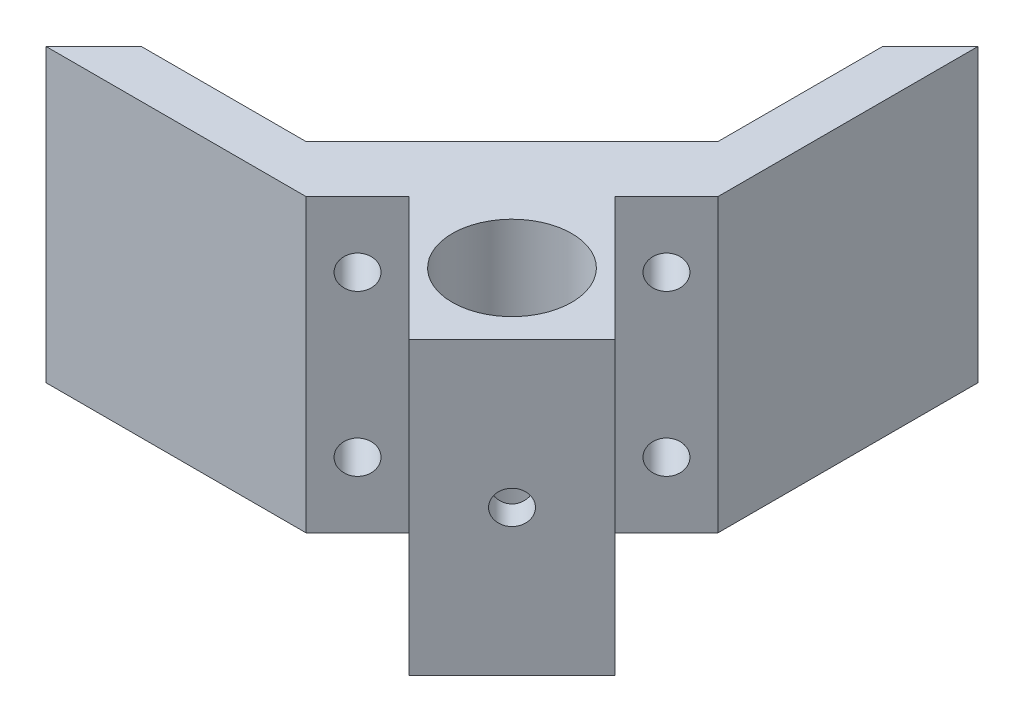
ISO-10303-21;
HEADER;
FILE_DESCRIPTION(('STEP AP214'),'2;1');
FILE_NAME('part.step','',(''),(''),'','','');
FILE_SCHEMA(('AUTOMOTIVE_DESIGN { 1 0 10303 214 1 1 1 1 }'));
ENDSEC;
DATA;
#1=APPLICATION_CONTEXT('core data for automotive mechanical design processes');
#2=APPLICATION_PROTOCOL_DEFINITION('international standard','automotive_design',2000,#1);
#3=PRODUCT_CONTEXT('',#1,'mechanical');
#4=PRODUCT('Part','Part','',(#3));
#5=PRODUCT_RELATED_PRODUCT_CATEGORY('part','',(#4));
#6=PRODUCT_DEFINITION_FORMATION('','',#4);
#7=PRODUCT_DEFINITION_CONTEXT('part definition',#1,'design');
#8=PRODUCT_DEFINITION('design','',#6,#7);
#9=PRODUCT_DEFINITION_SHAPE('','',#8);
#10=(LENGTH_UNIT() NAMED_UNIT(*) SI_UNIT(.MILLI.,.METRE.));
#11=(NAMED_UNIT(*) PLANE_ANGLE_UNIT() SI_UNIT($,.RADIAN.));
#12=(NAMED_UNIT(*) SI_UNIT($,.STERADIAN.) SOLID_ANGLE_UNIT());
#13=UNCERTAINTY_MEASURE_WITH_UNIT(LENGTH_MEASURE(1.E-05),#10,'distance_accuracy_value','');
#14=(GEOMETRIC_REPRESENTATION_CONTEXT(3) GLOBAL_UNCERTAINTY_ASSIGNED_CONTEXT((#13)) GLOBAL_UNIT_ASSIGNED_CONTEXT((#10,
#11,#12)) REPRESENTATION_CONTEXT('',''));
#15=CARTESIAN_POINT('',(0.,0.,0.));
#16=DIRECTION('',(0.,0.,1.));
#17=DIRECTION('',(1.,0.,0.));
#18=AXIS2_PLACEMENT_3D('',#15,#16,#17);
#19=CARTESIAN_POINT('',(22.3223304703363,0.,22.3223304703363));
#20=DIRECTION('',(0.707106781186548,0.,0.707106781186547));
#21=DIRECTION('',(0.707106781186547,0.,-0.707106781186548));
#22=AXIS2_PLACEMENT_3D('',#19,#20,#21);
#23=PLANE('',#22);
#24=CARTESIAN_POINT('',(35.5805826175841,38.75,9.06407832308853));
#25=DIRECTION('',(0.707106781186548,0.,0.707106781186547));
#26=DIRECTION('',(0.707106781186547,0.,-0.707106781186548));
#27=AXIS2_PLACEMENT_3D('',#24,#25,#26);
#28=CIRCLE('',#27,2.84999999999999);
#29=CARTESIAN_POINT('',(37.5958369439658,38.75,7.04882399670688));
#30=VERTEX_POINT('',#29);
#31=EDGE_CURVE('E415',#30,#30,#28,.T.);
#32=ORIENTED_EDGE('',*,*,#31,.F.);
#33=EDGE_LOOP('',(#32));
#34=FACE_BOUND('',#33,.T.);
#35=CARTESIAN_POINT('',(35.5805826175843,11.25,9.06407832308833));
#36=DIRECTION('',(0.707106781186548,0.,0.707106781186547));
#37=DIRECTION('',(0.707106781186547,0.,-0.707106781186548));
#38=AXIS2_PLACEMENT_3D('',#35,#36,#37);
#39=CIRCLE('',#38,2.84999999999999);
#40=CARTESIAN_POINT('',(37.595836943966,11.25,7.04882399670668));
#41=VERTEX_POINT('',#40);
#42=EDGE_CURVE('E399',#41,#41,#39,.T.);
#43=ORIENTED_EDGE('',*,*,#42,.F.);
#44=EDGE_LOOP('',(#43));
#45=FACE_BOUND('',#44,.T.);
#46=DIRECTION('',(0.,1.,0.));
#47=VECTOR('',#46,1.);
#48=CARTESIAN_POINT('',(31.1611652351682,50.,13.4834957055045));
#49=LINE('',#48,#47);
#50=CARTESIAN_POINT('',(31.1611652351682,0.,13.4834957055045));
#51=VERTEX_POINT('',#50);
#52=CARTESIAN_POINT('',(31.1611652351682,50.,13.4834957055045));
#53=VERTEX_POINT('',#52);
#54=EDGE_CURVE('E88',#51,#53,#49,.T.);
#55=ORIENTED_EDGE('',*,*,#54,.F.);
#56=DIRECTION('',(0.707106781186547,0.,-0.707106781186548));
#57=VECTOR('',#56,1.);
#58=CARTESIAN_POINT('',(22.3223304703363,0.,22.3223304703363));
#59=LINE('',#58,#57);
#60=CARTESIAN_POINT('',(40.,0.,4.64466094067263));
#61=VERTEX_POINT('',#60);
#62=EDGE_CURVE('E196',#51,#61,#59,.T.);
#63=ORIENTED_EDGE('',*,*,#62,.T.);
#64=DIRECTION('',(0.,1.,0.));
#65=VECTOR('',#64,1.);
#66=CARTESIAN_POINT('',(40.,0.,4.64466094067263));
#67=LINE('',#66,#65);
#68=CARTESIAN_POINT('',(40.,50.,4.64466094067263));
#69=VERTEX_POINT('',#68);
#70=EDGE_CURVE('E203',#61,#69,#67,.T.);
#71=ORIENTED_EDGE('',*,*,#70,.T.);
#72=DIRECTION('',(0.707106781186547,0.,-0.707106781186548));
#73=VECTOR('',#72,1.);
#74=CARTESIAN_POINT('',(22.3223304703363,50.,22.3223304703363));
#75=LINE('',#74,#73);
#76=EDGE_CURVE('E93',#53,#69,#75,.T.);
#77=ORIENTED_EDGE('',*,*,#76,.F.);
#78=EDGE_LOOP('',(#55,#63,#71,#77));
#79=FACE_BOUND('',#78,.T.);
#80=ADVANCED_FACE('F69',(#34,#45,#79),#23,.T.);
#81=CARTESIAN_POINT('',(-40.,50.,40.));
#82=DIRECTION('',(-0.707106781186548,0.,-0.707106781186547));
#83=DIRECTION('',(-0.707106781186547,0.,0.707106781186548));
#84=AXIS2_PLACEMENT_3D('',#81,#82,#83);
#85=PLANE('',#84);
#86=DIRECTION('',(0.707106781186547,0.,-0.707106781186548));
#87=VECTOR('',#86,1.);
#88=CARTESIAN_POINT('',(-40.,0.,40.));
#89=LINE('',#88,#87);
#90=CARTESIAN_POINT('',(31.8198051533946,0.,-31.8198051533947));
#91=VERTEX_POINT('',#90);
#92=CARTESIAN_POINT('',(40.,0.,-40.));
#93=VERTEX_POINT('',#92);
#94=EDGE_CURVE('E233',#91,#93,#89,.T.);
#95=ORIENTED_EDGE('',*,*,#94,.F.);
#96=DIRECTION('',(0.,1.,0.));
#97=VECTOR('',#96,1.);
#98=CARTESIAN_POINT('',(31.8198051533946,0.,-31.8198051533947));
#99=LINE('',#98,#97);
#100=CARTESIAN_POINT('',(31.8198051533946,50.,-31.8198051533947));
#101=VERTEX_POINT('',#100);
#102=EDGE_CURVE('E226',#91,#101,#99,.T.);
#103=ORIENTED_EDGE('',*,*,#102,.T.);
#104=DIRECTION('',(0.707106781186547,0.,-0.707106781186548));
#105=VECTOR('',#104,1.);
#106=CARTESIAN_POINT('',(-40.,50.,40.));
#107=LINE('',#106,#105);
#108=CARTESIAN_POINT('',(40.,50.,-40.));
#109=VERTEX_POINT('',#108);
#110=EDGE_CURVE('E247',#101,#109,#107,.T.);
#111=ORIENTED_EDGE('',*,*,#110,.T.);
#112=DIRECTION('',(0.,-1.,0.));
#113=VECTOR('',#112,1.);
#114=CARTESIAN_POINT('',(40.,50.,-40.));
#115=LINE('',#114,#113);
#116=EDGE_CURVE('E74',#109,#93,#115,.T.);
#117=ORIENTED_EDGE('',*,*,#116,.T.);
#118=EDGE_LOOP('',(#95,#103,#111,#117));
#119=FACE_BOUND('',#118,.T.);
#120=ADVANCED_FACE('F279',(#119),#85,.T.);
#121=CARTESIAN_POINT('',(0.,0.,0.));
#122=DIRECTION('',(0.,-1.,0.));
#123=DIRECTION('',(0.,0.,-1.));
#124=AXIS2_PLACEMENT_3D('',#121,#122,#123);
#125=PLANE('',#124);
#126=CARTESIAN_POINT('',(32.9289321881345,0.,32.9289321881345));
#127=DIRECTION('',(0.,1.,0.));
#128=DIRECTION('',(0.,0.,1.));
#129=AXIS2_PLACEMENT_3D('',#126,#127,#128);
#130=CIRCLE('',#129,10.25);
#131=CARTESIAN_POINT('',(32.9289321881345,0.,43.1789321881345));
#132=VERTEX_POINT('',#131);
#133=EDGE_CURVE('E357',#132,#132,#130,.T.);
#134=ORIENTED_EDGE('',*,*,#133,.T.);
#135=EDGE_LOOP('',(#134));
#136=FACE_BOUND('',#135,.T.);
#137=CARTESIAN_POINT('',(4.64466094067267,0.,40.));
#138=VERTEX_POINT('',#137);
#139=CARTESIAN_POINT('',(13.4834957055045,0.,31.1611652351682));
#140=VERTEX_POINT('',#139);
#141=EDGE_CURVE('E194',#138,#140,#59,.T.);
#142=ORIENTED_EDGE('',*,*,#141,.F.);
#143=DIRECTION('',(1.,0.,0.));
#144=VECTOR('',#143,1.);
#145=CARTESIAN_POINT('',(-40.,0.,40.));
#146=LINE('',#145,#144);
#147=CARTESIAN_POINT('',(-40.,0.,40.));
#148=VERTEX_POINT('',#147);
#149=EDGE_CURVE('E263',#148,#138,#146,.T.);
#150=ORIENTED_EDGE('',*,*,#149,.F.);
#151=CARTESIAN_POINT('',(-31.8198051533946,0.,31.8198051533947));
#152=VERTEX_POINT('',#151);
#153=EDGE_CURVE('E254',#148,#152,#89,.T.);
#154=ORIENTED_EDGE('',*,*,#153,.T.);
#155=DIRECTION('',(-1.,0.,0.));
#156=VECTOR('',#155,1.);
#157=CARTESIAN_POINT('',(0.,0.,31.8198051533947));
#158=LINE('',#157,#156);
#159=CARTESIAN_POINT('',(-3.53553390593274,0.,31.8198051533947));
#160=VERTEX_POINT('',#159);
#161=EDGE_CURVE('E208',#160,#152,#158,.T.);
#162=ORIENTED_EDGE('',*,*,#161,.F.);
#163=DIRECTION('',(0.707106781186547,0.,-0.707106781186548));
#164=VECTOR('',#163,1.);
#165=CARTESIAN_POINT('',(14.142135623731,0.,14.1421356237309));
#166=LINE('',#165,#164);
#167=CARTESIAN_POINT('',(31.8198051533946,0.,-3.53553390593273));
#168=VERTEX_POINT('',#167);
#169=EDGE_CURVE('E211',#160,#168,#166,.T.);
#170=ORIENTED_EDGE('',*,*,#169,.T.);
#171=DIRECTION('',(0.,0.,-1.));
#172=VECTOR('',#171,1.);
#173=CARTESIAN_POINT('',(31.8198051533946,0.,0.));
#174=LINE('',#173,#172);
#175=EDGE_CURVE('E216',#168,#91,#174,.T.);
#176=ORIENTED_EDGE('',*,*,#175,.T.);
#177=ORIENTED_EDGE('',*,*,#94,.T.);
#178=DIRECTION('',(0.,0.,1.));
#179=VECTOR('',#178,1.);
#180=CARTESIAN_POINT('',(40.,0.,-40.));
#181=LINE('',#180,#179);
#182=EDGE_CURVE('E259',#93,#61,#181,.T.);
#183=ORIENTED_EDGE('',*,*,#182,.T.);
#184=ORIENTED_EDGE('',*,*,#62,.F.);
#185=DIRECTION('',(-0.707106781186548,0.,-0.707106781186547));
#186=VECTOR('',#185,1.);
#187=CARTESIAN_POINT('',(52.3743686707646,0.,34.6966991411009));
#188=LINE('',#187,#186);
#189=CARTESIAN_POINT('',(52.3743686707646,0.,34.6966991411009));
#190=VERTEX_POINT('',#189);
#191=EDGE_CURVE('E334',#190,#51,#188,.T.);
#192=ORIENTED_EDGE('',*,*,#191,.F.);
#193=DIRECTION('',(0.707106781186547,0.,-0.707106781186548));
#194=VECTOR('',#193,1.);
#195=CARTESIAN_POINT('',(34.6966991411009,0.,52.3743686707646));
#196=LINE('',#195,#194);
#197=CARTESIAN_POINT('',(34.6966991411009,0.,52.3743686707646));
#198=VERTEX_POINT('',#197);
#199=EDGE_CURVE('E171',#198,#190,#196,.T.);
#200=ORIENTED_EDGE('',*,*,#199,.F.);
#201=DIRECTION('',(-0.707106781186548,0.,-0.707106781186547));
#202=VECTOR('',#201,1.);
#203=CARTESIAN_POINT('',(34.6966991411009,0.,52.3743686707646));
#204=LINE('',#203,#202);
#205=EDGE_CURVE('E191',#198,#140,#204,.T.);
#206=ORIENTED_EDGE('',*,*,#205,.T.);
#207=EDGE_LOOP('',(#142,#150,#154,#162,#170,#176,#177,#183,#184,#192,#200,#206));
#208=FACE_BOUND('',#207,.T.);
#209=ADVANCED_FACE('F287',(#136,#208),#125,.T.);
#210=DIRECTION('',(0.,1.,0.));
#211=VECTOR('',#210,1.);
#212=CARTESIAN_POINT('',(-31.8198051533946,0.,31.8198051533947));
#213=LINE('',#212,#211);
#214=CARTESIAN_POINT('',(-31.8198051533946,50.,31.8198051533947));
#215=VERTEX_POINT('',#214);
#216=EDGE_CURVE('E219',#152,#215,#213,.T.);
#217=ORIENTED_EDGE('',*,*,#216,.F.);
#218=ORIENTED_EDGE('',*,*,#153,.F.);
#219=DIRECTION('',(0.,-1.,0.));
#220=VECTOR('',#219,1.);
#221=CARTESIAN_POINT('',(-40.,50.,40.));
#222=LINE('',#221,#220);
#223=CARTESIAN_POINT('',(-40.,50.,40.));
#224=VERTEX_POINT('',#223);
#225=EDGE_CURVE('E12',#224,#148,#222,.T.);
#226=ORIENTED_EDGE('',*,*,#225,.F.);
#227=EDGE_CURVE('E242',#224,#215,#107,.T.);
#228=ORIENTED_EDGE('',*,*,#227,.T.);
#229=EDGE_LOOP('',(#217,#218,#226,#228));
#230=FACE_BOUND('',#229,.T.);
#231=ADVANCED_FACE('F75',(#230),#85,.T.);
#232=CARTESIAN_POINT('',(-40.,50.,40.));
#233=DIRECTION('',(0.,0.,-1.));
#234=DIRECTION('',(-1.,0.,0.));
#235=AXIS2_PLACEMENT_3D('',#232,#233,#234);
#236=PLANE('',#235);
#237=ORIENTED_EDGE('',*,*,#149,.T.);
#238=DIRECTION('',(0.,1.,0.));
#239=VECTOR('',#238,1.);
#240=CARTESIAN_POINT('',(4.64466094067267,0.,40.));
#241=LINE('',#240,#239);
#242=CARTESIAN_POINT('',(4.64466094067267,50.,40.));
#243=VERTEX_POINT('',#242);
#244=EDGE_CURVE('E197',#138,#243,#241,.T.);
#245=ORIENTED_EDGE('',*,*,#244,.T.);
#246=DIRECTION('',(1.,0.,0.));
#247=VECTOR('',#246,1.);
#248=CARTESIAN_POINT('',(-40.,50.,40.));
#249=LINE('',#248,#247);
#250=EDGE_CURVE('E252',#224,#243,#249,.T.);
#251=ORIENTED_EDGE('',*,*,#250,.F.);
#252=ORIENTED_EDGE('',*,*,#225,.T.);
#253=EDGE_LOOP('',(#237,#245,#251,#252));
#254=FACE_BOUND('',#253,.T.);
#255=ADVANCED_FACE('F511',(#254),#236,.F.);
#256=CARTESIAN_POINT('',(40.,50.,-40.));
#257=DIRECTION('',(1.,0.,0.));
#258=DIRECTION('',(0.,0.,-1.));
#259=AXIS2_PLACEMENT_3D('',#256,#257,#258);
#260=PLANE('',#259);
#261=ORIENTED_EDGE('',*,*,#70,.F.);
#262=ORIENTED_EDGE('',*,*,#182,.F.);
#263=ORIENTED_EDGE('',*,*,#116,.F.);
#264=DIRECTION('',(0.,0.,1.));
#265=VECTOR('',#264,1.);
#266=CARTESIAN_POINT('',(40.,50.,-40.));
#267=LINE('',#266,#265);
#268=EDGE_CURVE('E250',#109,#69,#267,.T.);
#269=ORIENTED_EDGE('',*,*,#268,.T.);
#270=EDGE_LOOP('',(#261,#262,#263,#269));
#271=FACE_BOUND('',#270,.T.);
#272=ADVANCED_FACE('F285',(#271),#260,.T.);
#273=CARTESIAN_POINT('',(0.,50.,0.));
#274=DIRECTION('',(0.,-1.,0.));
#275=DIRECTION('',(0.,0.,-1.));
#276=AXIS2_PLACEMENT_3D('',#273,#274,#275);
#277=PLANE('',#276);
#278=CARTESIAN_POINT('',(32.9289321881345,50.,32.9289321881345));
#279=DIRECTION('',(0.,1.,0.));
#280=DIRECTION('',(0.,0.,1.));
#281=AXIS2_PLACEMENT_3D('',#278,#279,#280);
#282=CIRCLE('',#281,10.25);
#283=CARTESIAN_POINT('',(32.9289321881345,50.,43.1789321881345));
#284=VERTEX_POINT('',#283);
#285=EDGE_CURVE('E365',#284,#284,#282,.T.);
#286=ORIENTED_EDGE('',*,*,#285,.F.);
#287=EDGE_LOOP('',(#286));
#288=FACE_BOUND('',#287,.T.);
#289=ORIENTED_EDGE('',*,*,#250,.T.);
#290=CARTESIAN_POINT('',(13.4834957055045,50.,31.1611652351682));
#291=VERTEX_POINT('',#290);
#292=EDGE_CURVE('E190',#243,#291,#75,.T.);
#293=ORIENTED_EDGE('',*,*,#292,.T.);
#294=DIRECTION('',(-0.707106781186548,0.,-0.707106781186547));
#295=VECTOR('',#294,1.);
#296=CARTESIAN_POINT('',(34.6966991411009,50.,52.3743686707646));
#297=LINE('',#296,#295);
#298=CARTESIAN_POINT('',(34.6966991411009,50.,52.3743686707646));
#299=VERTEX_POINT('',#298);
#300=EDGE_CURVE('E164',#299,#291,#297,.T.);
#301=ORIENTED_EDGE('',*,*,#300,.F.);
#302=DIRECTION('',(-0.707106781186547,0.,0.707106781186548));
#303=VECTOR('',#302,1.);
#304=CARTESIAN_POINT('',(34.6966991411009,50.,52.3743686707646));
#305=LINE('',#304,#303);
#306=CARTESIAN_POINT('',(52.3743686707646,50.,34.6966991411009));
#307=VERTEX_POINT('',#306);
#308=EDGE_CURVE('E160',#307,#299,#305,.T.);
#309=ORIENTED_EDGE('',*,*,#308,.F.);
#310=DIRECTION('',(-0.707106781186548,0.,-0.707106781186547));
#311=VECTOR('',#310,1.);
#312=CARTESIAN_POINT('',(52.3743686707646,50.,34.6966991411009));
#313=LINE('',#312,#311);
#314=EDGE_CURVE('E165',#307,#53,#313,.T.);
#315=ORIENTED_EDGE('',*,*,#314,.T.);
#316=ORIENTED_EDGE('',*,*,#76,.T.);
#317=ORIENTED_EDGE('',*,*,#268,.F.);
#318=ORIENTED_EDGE('',*,*,#110,.F.);
#319=DIRECTION('',(0.,0.,-1.));
#320=VECTOR('',#319,1.);
#321=CARTESIAN_POINT('',(31.8198051533946,50.,0.));
#322=LINE('',#321,#320);
#323=CARTESIAN_POINT('',(31.8198051533946,50.,-3.53553390593273));
#324=VERTEX_POINT('',#323);
#325=EDGE_CURVE('E215',#324,#101,#322,.T.);
#326=ORIENTED_EDGE('',*,*,#325,.F.);
#327=DIRECTION('',(0.707106781186547,0.,-0.707106781186548));
#328=VECTOR('',#327,1.);
#329=CARTESIAN_POINT('',(14.142135623731,50.,14.1421356237309));
#330=LINE('',#329,#328);
#331=CARTESIAN_POINT('',(-3.53553390593274,50.,31.8198051533947));
#332=VERTEX_POINT('',#331);
#333=EDGE_CURVE('E221',#332,#324,#330,.T.);
#334=ORIENTED_EDGE('',*,*,#333,.F.);
#335=DIRECTION('',(-1.,0.,0.));
#336=VECTOR('',#335,1.);
#337=CARTESIAN_POINT('',(0.,50.,31.8198051533947));
#338=LINE('',#337,#336);
#339=EDGE_CURVE('E204',#332,#215,#338,.T.);
#340=ORIENTED_EDGE('',*,*,#339,.T.);
#341=ORIENTED_EDGE('',*,*,#227,.F.);
#342=EDGE_LOOP('',(#289,#293,#301,#309,#315,#316,#317,#318,#326,#334,#340,#341));
#343=FACE_BOUND('',#342,.T.);
#344=ADVANCED_FACE('F159',(#288,#343),#277,.F.);
#345=CARTESIAN_POINT('',(31.8198051533946,0.,0.));
#346=DIRECTION('',(1.,0.,0.));
#347=DIRECTION('',(0.,0.,-1.));
#348=AXIS2_PLACEMENT_3D('',#345,#346,#347);
#349=PLANE('',#348);
#350=ORIENTED_EDGE('',*,*,#325,.T.);
#351=ORIENTED_EDGE('',*,*,#102,.F.);
#352=ORIENTED_EDGE('',*,*,#175,.F.);
#353=DIRECTION('',(0.,1.,0.));
#354=VECTOR('',#353,1.);
#355=CARTESIAN_POINT('',(31.8198051533946,0.,-3.53553390593273));
#356=LINE('',#355,#354);
#357=EDGE_CURVE('E234',#168,#324,#356,.T.);
#358=ORIENTED_EDGE('',*,*,#357,.T.);
#359=EDGE_LOOP('',(#350,#351,#352,#358));
#360=FACE_BOUND('',#359,.T.);
#361=ADVANCED_FACE('F498',(#360),#349,.F.);
#362=CARTESIAN_POINT('',(14.142135623731,0.,14.1421356237309));
#363=DIRECTION('',(0.707106781186548,0.,0.707106781186547));
#364=DIRECTION('',(0.707106781186547,0.,-0.707106781186548));
#365=AXIS2_PLACEMENT_3D('',#362,#363,#364);
#366=PLANE('',#365);
#367=CARTESIAN_POINT('',(0.883883476483207,38.75,27.4003877709787));
#368=DIRECTION('',(0.707106781186548,0.,0.707106781186547));
#369=DIRECTION('',(0.707106781186547,0.,-0.707106781186548));
#370=AXIS2_PLACEMENT_3D('',#367,#368,#369);
#371=CIRCLE('',#370,2.85);
#372=CARTESIAN_POINT('',(2.89913780286487,38.75,25.385133444597));
#373=VERTEX_POINT('',#372);
#374=EDGE_CURVE('E416',#373,#373,#371,.T.);
#375=ORIENTED_EDGE('',*,*,#374,.T.);
#376=EDGE_LOOP('',(#375));
#377=FACE_BOUND('',#376,.T.);
#378=CARTESIAN_POINT('',(27.4003877709787,38.75,0.88388347648316));
#379=DIRECTION('',(0.707106781186548,0.,0.707106781186547));
#380=DIRECTION('',(0.707106781186547,0.,-0.707106781186548));
#381=AXIS2_PLACEMENT_3D('',#378,#379,#380);
#382=CIRCLE('',#381,2.85);
#383=CARTESIAN_POINT('',(29.4156420973604,38.75,-1.1313708498985));
#384=VERTEX_POINT('',#383);
#385=EDGE_CURVE('E408',#384,#384,#382,.T.);
#386=ORIENTED_EDGE('',*,*,#385,.T.);
#387=EDGE_LOOP('',(#386));
#388=FACE_BOUND('',#387,.T.);
#389=CARTESIAN_POINT('',(27.4003877709789,11.25,0.883883476482959));
#390=DIRECTION('',(0.707106781186548,0.,0.707106781186547));
#391=DIRECTION('',(0.707106781186547,0.,-0.707106781186548));
#392=AXIS2_PLACEMENT_3D('',#389,#390,#391);
#393=CIRCLE('',#392,2.85);
#394=CARTESIAN_POINT('',(29.4156420973606,11.25,-1.1313708498987));
#395=VERTEX_POINT('',#394);
#396=EDGE_CURVE('E395',#395,#395,#393,.T.);
#397=ORIENTED_EDGE('',*,*,#396,.T.);
#398=EDGE_LOOP('',(#397));
#399=FACE_BOUND('',#398,.T.);
#400=CARTESIAN_POINT('',(0.88388347648341,11.25,27.4003877709785));
#401=DIRECTION('',(0.707106781186548,0.,0.707106781186547));
#402=DIRECTION('',(0.707106781186547,0.,-0.707106781186548));
#403=AXIS2_PLACEMENT_3D('',#400,#401,#402);
#404=CIRCLE('',#403,2.85);
#405=CARTESIAN_POINT('',(2.89913780286507,11.25,25.3851334445968));
#406=VERTEX_POINT('',#405);
#407=EDGE_CURVE('E385',#406,#406,#404,.T.);
#408=ORIENTED_EDGE('',*,*,#407,.T.);
#409=EDGE_LOOP('',(#408));
#410=FACE_BOUND('',#409,.T.);
#411=ORIENTED_EDGE('',*,*,#333,.T.);
#412=ORIENTED_EDGE('',*,*,#357,.F.);
#413=ORIENTED_EDGE('',*,*,#169,.F.);
#414=DIRECTION('',(0.,1.,0.));
#415=VECTOR('',#414,1.);
#416=CARTESIAN_POINT('',(-3.53553390593274,0.,31.8198051533947));
#417=LINE('',#416,#415);
#418=EDGE_CURVE('E236',#160,#332,#417,.T.);
#419=ORIENTED_EDGE('',*,*,#418,.T.);
#420=EDGE_LOOP('',(#411,#412,#413,#419));
#421=FACE_BOUND('',#420,.T.);
#422=ADVANCED_FACE('F477',(#377,#388,#399,#410,#421),#366,.F.);
#423=CARTESIAN_POINT('',(0.,0.,31.8198051533947));
#424=DIRECTION('',(0.,0.,-1.));
#425=DIRECTION('',(-1.,0.,0.));
#426=AXIS2_PLACEMENT_3D('',#423,#424,#425);
#427=PLANE('',#426);
#428=ORIENTED_EDGE('',*,*,#339,.F.);
#429=ORIENTED_EDGE('',*,*,#418,.F.);
#430=ORIENTED_EDGE('',*,*,#161,.T.);
#431=ORIENTED_EDGE('',*,*,#216,.T.);
#432=EDGE_LOOP('',(#428,#429,#430,#431));
#433=FACE_BOUND('',#432,.T.);
#434=ADVANCED_FACE('F475',(#433),#427,.T.);
#435=CARTESIAN_POINT('',(9.06407832308858,38.75,35.5805826175841));
#436=DIRECTION('',(0.707106781186548,0.,0.707106781186547));
#437=DIRECTION('',(0.707106781186547,0.,-0.707106781186548));
#438=AXIS2_PLACEMENT_3D('',#435,#436,#437);
#439=CIRCLE('',#438,2.84999999999999);
#440=CARTESIAN_POINT('',(11.0793326494702,38.75,33.5653282912024));
#441=VERTEX_POINT('',#440);
#442=EDGE_CURVE('E424',#441,#441,#439,.T.);
#443=ORIENTED_EDGE('',*,*,#442,.F.);
#444=EDGE_LOOP('',(#443));
#445=FACE_BOUND('',#444,.T.);
#446=CARTESIAN_POINT('',(9.06407832308878,11.25,35.5805826175839));
#447=DIRECTION('',(0.707106781186548,0.,0.707106781186547));
#448=DIRECTION('',(0.707106781186547,0.,-0.707106781186548));
#449=AXIS2_PLACEMENT_3D('',#446,#447,#448);
#450=CIRCLE('',#449,2.84999999999999);
#451=CARTESIAN_POINT('',(11.0793326494704,11.25,33.5653282912022));
#452=VERTEX_POINT('',#451);
#453=EDGE_CURVE('E389',#452,#452,#450,.T.);
#454=ORIENTED_EDGE('',*,*,#453,.F.);
#455=EDGE_LOOP('',(#454));
#456=FACE_BOUND('',#455,.T.);
#457=DIRECTION('',(0.,-1.,0.));
#458=VECTOR('',#457,1.);
#459=CARTESIAN_POINT('',(13.4834957055045,50.,31.1611652351682));
#460=LINE('',#459,#458);
#461=EDGE_CURVE('E179',#291,#140,#460,.T.);
#462=ORIENTED_EDGE('',*,*,#461,.F.);
#463=ORIENTED_EDGE('',*,*,#292,.F.);
#464=ORIENTED_EDGE('',*,*,#244,.F.);
#465=ORIENTED_EDGE('',*,*,#141,.T.);
#466=EDGE_LOOP('',(#462,#463,#464,#465));
#467=FACE_BOUND('',#466,.T.);
#468=ADVANCED_FACE('F466',(#445,#456,#467),#23,.T.);
#469=CARTESIAN_POINT('',(52.3743686707646,50.,34.6966991411009));
#470=DIRECTION('',(-0.707106781186547,0.,0.707106781186548));
#471=DIRECTION('',(0.707106781186548,0.,0.707106781186547));
#472=AXIS2_PLACEMENT_3D('',#469,#470,#471);
#473=PLANE('',#472);
#474=ORIENTED_EDGE('',*,*,#54,.T.);
#475=ORIENTED_EDGE('',*,*,#314,.F.);
#476=DIRECTION('',(0.,1.,0.));
#477=VECTOR('',#476,1.);
#478=CARTESIAN_POINT('',(52.3743686707646,50.,34.6966991411009));
#479=LINE('',#478,#477);
#480=EDGE_CURVE('E168',#190,#307,#479,.T.);
#481=ORIENTED_EDGE('',*,*,#480,.F.);
#482=ORIENTED_EDGE('',*,*,#191,.T.);
#483=EDGE_LOOP('',(#474,#475,#481,#482));
#484=FACE_BOUND('',#483,.T.);
#485=ADVANCED_FACE('F185',(#484),#473,.F.);
#486=CARTESIAN_POINT('',(34.6966991411009,50.,52.3743686707646));
#487=DIRECTION('',(0.707106781186547,0.,-0.707106781186548));
#488=DIRECTION('',(-0.707106781186548,0.,-0.707106781186547));
#489=AXIS2_PLACEMENT_3D('',#486,#487,#488);
#490=PLANE('',#489);
#491=ORIENTED_EDGE('',*,*,#461,.T.);
#492=ORIENTED_EDGE('',*,*,#205,.F.);
#493=DIRECTION('',(0.,-1.,0.));
#494=VECTOR('',#493,1.);
#495=CARTESIAN_POINT('',(34.6966991411009,50.,52.3743686707646));
#496=LINE('',#495,#494);
#497=EDGE_CURVE('E166',#299,#198,#496,.T.);
#498=ORIENTED_EDGE('',*,*,#497,.F.);
#499=ORIENTED_EDGE('',*,*,#300,.T.);
#500=EDGE_LOOP('',(#491,#492,#498,#499));
#501=FACE_BOUND('',#500,.T.);
#502=ADVANCED_FACE('F479',(#501),#490,.F.);
#503=CARTESIAN_POINT('',(43.5355339059328,0.,43.5355339059327));
#504=DIRECTION('',(0.707106781186548,0.,0.707106781186547));
#505=DIRECTION('',(0.707106781186547,0.,-0.707106781186548));
#506=AXIS2_PLACEMENT_3D('',#503,#504,#505);
#507=PLANE('',#506);
#508=CARTESIAN_POINT('',(43.5355339059328,25.,43.5355339059327));
#509=DIRECTION('',(0.707106781186548,0.,0.707106781186548));
#510=DIRECTION('',(0.707106781186548,0.,-0.707106781186548));
#511=AXIS2_PLACEMENT_3D('',#508,#509,#510);
#512=CIRCLE('',#511,2.84999999999998);
#513=CARTESIAN_POINT('',(45.5507882323144,25.,41.5202795795511));
#514=VERTEX_POINT('',#513);
#515=EDGE_CURVE('E376',#514,#514,#512,.T.);
#516=ORIENTED_EDGE('',*,*,#515,.F.);
#517=EDGE_LOOP('',(#516));
#518=FACE_BOUND('',#517,.T.);
#519=ORIENTED_EDGE('',*,*,#480,.T.);
#520=ORIENTED_EDGE('',*,*,#308,.T.);
#521=ORIENTED_EDGE('',*,*,#497,.T.);
#522=ORIENTED_EDGE('',*,*,#199,.T.);
#523=EDGE_LOOP('',(#519,#520,#521,#522));
#524=FACE_BOUND('',#523,.T.);
#525=ADVANCED_FACE('F172',(#518,#524),#507,.T.);
#526=CARTESIAN_POINT('',(32.9289321881345,50.,32.9289321881345));
#527=DIRECTION('',(0.,1.,0.));
#528=DIRECTION('',(0.,0.,1.));
#529=AXIS2_PLACEMENT_3D('',#526,#527,#528);
#530=CYLINDRICAL_SURFACE('',#529,10.25);
#531=CARTESIAN_POINT('',(41.906226445456,25.,37.8757177926926));
#532=CARTESIAN_POINT('',(41.9062258791164,25.1567285068392,37.8757218014114));
#533=CARTESIAN_POINT('',(41.8997287317283,25.3134902881636,37.8875657678911));
#534=CARTESIAN_POINT('',(41.8737357687847,25.6224681729213,37.9342974124624));
#535=CARTESIAN_POINT('',(41.8542341650115,25.7746822206472,37.969195351696));
#536=CARTESIAN_POINT('',(41.8022682348078,26.0700494720942,38.0601234229363));
#537=CARTESIAN_POINT('',(41.7698232170624,26.213215806105,38.1161220705244));
#538=CARTESIAN_POINT('',(41.6919718469681,26.4870513100817,38.246580445374));
#539=CARTESIAN_POINT('',(41.6465641706344,26.617719201656,38.3210420583106));
#540=CARTESIAN_POINT('',(41.5415515289413,26.8664009404521,38.4872740700146));
#541=CARTESIAN_POINT('',(41.4816249519648,26.9840246828248,38.5794250180486));
#542=CARTESIAN_POINT('',(41.3484182550043,27.199822142028,38.7760541429058));
#543=CARTESIAN_POINT('',(41.2751366484556,27.2979936910694,38.8805336915837));
#544=CARTESIAN_POINT('',(41.1143870031799,27.4737488091699,39.0997993336552));
#545=CARTESIAN_POINT('',(41.0266927835477,27.5509412773896,39.2147340011252));
#546=CARTESIAN_POINT('',(40.8393083075163,27.6799908082846,39.4489711886055));
#547=CARTESIAN_POINT('',(40.7396202619204,27.7318525312467,39.568272900833));
#548=CARTESIAN_POINT('',(40.5329244729502,27.8074965141102,39.8039410814558));
#549=CARTESIAN_POINT('',(40.4261595178736,27.8319431387941,39.9203069812988));
#550=CARTESIAN_POINT('',(40.2059727819904,27.854156646587,40.1492078033017));
#551=CARTESIAN_POINT('',(40.0925522123942,27.8519283691903,40.2617434166561));
#552=CARTESIAN_POINT('',(39.8656771464017,27.8213159840071,40.4766359010641));
#553=CARTESIAN_POINT('',(39.7523087234449,27.793650186153,40.5791871774238));
#554=CARTESIAN_POINT('',(39.5261206106588,27.7141127791354,40.7750779492427));
#555=CARTESIAN_POINT('',(39.4133009538124,27.6622397327515,40.8684168973534));
#556=CARTESIAN_POINT('',(39.1907604464912,27.5352312657466,41.0451151405538));
#557=CARTESIAN_POINT('',(39.0810847810598,27.4598564615918,41.1283589020694));
#558=CARTESIAN_POINT('',(38.8698530590609,27.2881695461326,41.2826796173034));
#559=CARTESIAN_POINT('',(38.7682987086544,27.1918530510302,41.35375401799));
#560=CARTESIAN_POINT('',(38.5737735308506,26.9772317990329,41.485364309468));
#561=CARTESIAN_POINT('',(38.4812010888245,26.8583016968343,41.5454705124507));
#562=CARTESIAN_POINT('',(38.3124415695145,26.6037905926639,41.6519080834701));
#563=CARTESIAN_POINT('',(38.2362556799436,26.4682083848497,41.6982384531142));
#564=CARTESIAN_POINT('',(38.1032788108994,26.1828836577745,41.7773610874726));
#565=CARTESIAN_POINT('',(38.0466316263153,26.0330460924948,41.8100533359954));
#566=CARTESIAN_POINT('',(37.9564757720983,25.7242858101529,41.8614025929218));
#567=CARTESIAN_POINT('',(37.9229607828067,25.5653655873076,41.8800634347957));
#568=CARTESIAN_POINT('',(37.8816516473536,25.2484595759656,41.902984440691));
#569=CARTESIAN_POINT('',(37.873060698168,25.0906097958913,41.9076908300638));
#570=CARTESIAN_POINT('',(37.8798068884726,24.7755906932323,41.903972906408));
#571=CARTESIAN_POINT('',(37.8951412257544,24.6184212931211,41.8955501311105));
#572=CARTESIAN_POINT('',(37.9482913049231,24.3127012444814,41.8659013177762));
#573=CARTESIAN_POINT('',(37.9856198722522,24.1640382099143,41.8449525863637));
#574=CARTESIAN_POINT('',(38.0804697527148,23.8757373771323,41.7904857890889));
#575=CARTESIAN_POINT('',(38.1379938686937,23.7361008348488,41.7569659785015));
#576=CARTESIAN_POINT('',(38.2721776553121,23.4661730907926,41.6764159182968));
#577=CARTESIAN_POINT('',(38.3492572922891,23.3361806050537,41.6290851966637));
#578=CARTESIAN_POINT('',(38.5185336998953,23.0924804985603,41.5213069273754));
#579=CARTESIAN_POINT('',(38.6107335683767,22.9787762239177,41.4608566909549));
#580=CARTESIAN_POINT('',(38.8097958669731,22.767167573156,41.3249369484286));
#581=CARTESIAN_POINT('',(38.9170309334482,22.669879577898,41.2490514632135));
#582=CARTESIAN_POINT('',(39.139647718848,22.4984135770775,41.0842167098208));
#583=CARTESIAN_POINT('',(39.2550290058554,22.4242343474014,40.9952681339864));
#584=CARTESIAN_POINT('',(39.4887484060594,22.3017908455266,40.8063488413438));
#585=CARTESIAN_POINT('',(39.6070567831708,22.2533307591434,40.7064686025751));
#586=CARTESIAN_POINT('',(39.8432436795162,22.1831508107757,40.4972643139727));
#587=CARTESIAN_POINT('',(39.9611222960802,22.1614244637778,40.3879425613302));
#588=CARTESIAN_POINT('',(40.1886243061954,22.1457641440652,40.1665925374571));
#589=CARTESIAN_POINT('',(40.2983918709363,22.1509296366443,40.0547752934916));
#590=CARTESIAN_POINT('',(40.5107134066146,22.1867950729224,39.8284374033199));
#591=CARTESIAN_POINT('',(40.6132676914046,22.21749390491,39.7139168750244));
#592=CARTESIAN_POINT('',(40.8079580843996,22.3030282548051,39.4868026318083));
#593=CARTESIAN_POINT('',(40.900171565811,22.3576670540394,39.3742008258451));
#594=CARTESIAN_POINT('',(41.0735359236957,22.4893553684511,39.1536912047306));
#595=CARTESIAN_POINT('',(41.1546851470717,22.5664082271085,39.0457840926441));
#596=CARTESIAN_POINT('',(41.307109067093,22.7432939744997,38.835371356401));
#597=CARTESIAN_POINT('',(41.3780363494494,22.8437136053202,38.7331073834065));
#598=CARTESIAN_POINT('',(41.5066886581938,23.063388283389,38.5412370570223));
#599=CARTESIAN_POINT('',(41.5644101024235,23.1826484264374,38.4516341405301));
#600=CARTESIAN_POINT('',(41.6677067456627,23.4401297378434,38.2867337938436));
#601=CARTESIAN_POINT('',(41.7129499172034,23.5787436877109,38.2118403789733));
#602=CARTESIAN_POINT('',(41.7893101133162,23.8688521144957,38.0827525052883));
#603=CARTESIAN_POINT('',(41.8204356020693,24.0203388087634,38.0285456470606));
#604=CARTESIAN_POINT('',(41.865087117186,24.3091945880786,37.9498251881043));
#605=CARTESIAN_POINT('',(41.8805135289089,24.4454156853998,37.922141075862));
#606=CARTESIAN_POINT('',(41.9010827324787,24.7210827047313,37.8850868634717));
#607=CARTESIAN_POINT('',(41.9062269494384,24.8605281771325,37.8757142253562));
#608=CARTESIAN_POINT('',(41.906226445456,25.,37.8757177926926));
#609=B_SPLINE_CURVE_WITH_KNOTS('',3,(#531,#532,#533,#534,#535,#536,#537,#538,#539,#540,#541,
#542,#543,#544,#545,#546,#547,#548,#549,#550,#551,#552,#553,#554,#555,#556,#557,#558,#559,#560,
#561,#562,#563,#564,#565,#566,#567,#568,#569,#570,#571,#572,#573,#574,#575,#576,#577,#578,#579,
#580,#581,#582,#583,#584,#585,#586,#587,#588,#589,#590,#591,#592,#593,#594,#595,#596,#597,#598,
#599,#600,#601,#602,#603,#604,#605,#606,#607,#608),.UNSPECIFIED.,.T.,.F.,(4,2,2,2,2,2,2,2,2,2,2,
2,2,2,2,2,2,2,2,2,2,2,2,2,2,2,2,2,2,2,2,2,2,2,2,2,2,2,4),(0.,0.469672144992309,
0.939553478334597,1.40873645918053,1.87796737876788,2.35873499448755,2.83955615775734,
3.32880662314905,3.81796704353404,4.29499837326822,4.77194315890191,5.23582025131181,
5.69972488830109,6.16851825922542,6.6374098589624,7.12191376011741,7.6064527667562,
8.09448523183647,8.58238431482173,9.05450384105191,9.52656807523525,9.98854951786643,
10.4505951020962,10.9235563839258,11.3966146880019,11.8846949166895,12.3727492864766,
12.8570324937952,13.3411982015549,13.8092569813962,14.27729538321,14.7415579243647,
15.2058897545862,15.6834575019051,16.1611546389877,16.6505488850199,17.1396493282499,
17.5576658879848,17.9756245065747),.UNSPECIFIED.);
#610=CARTESIAN_POINT('',(41.906226445456,25.,37.8757177926926));
#611=VERTEX_POINT('',#610);
#612=EDGE_CURVE('E367',#611,#611,#609,.T.);
#613=ORIENTED_EDGE('',*,*,#612,.T.);
#614=EDGE_LOOP('',(#613));
#615=FACE_BOUND('',#614,.T.);
#616=ORIENTED_EDGE('',*,*,#133,.F.);
#617=EDGE_LOOP('',(#616));
#618=FACE_BOUND('',#617,.T.);
#619=ORIENTED_EDGE('',*,*,#285,.T.);
#620=EDGE_LOOP('',(#619));
#621=FACE_BOUND('',#620,.T.);
#622=ADVANCED_FACE('F443',(#615,#618,#621),#530,.F.);
#623=CARTESIAN_POINT('',(43.5355339059328,25.,43.5355339059327));
#624=DIRECTION('',(0.707106781186548,0.,0.707106781186548));
#625=DIRECTION('',(0.707106781186548,0.,-0.707106781186548));
#626=AXIS2_PLACEMENT_3D('',#623,#624,#625);
#627=CYLINDRICAL_SURFACE('',#626,2.84999999999999);
#628=ORIENTED_EDGE('',*,*,#612,.F.);
#629=EDGE_LOOP('',(#628));
#630=FACE_BOUND('',#629,.T.);
#631=ORIENTED_EDGE('',*,*,#515,.T.);
#632=EDGE_LOOP('',(#631));
#633=FACE_BOUND('',#632,.T.);
#634=ADVANCED_FACE('F439',(#630,#633),#627,.F.);
#635=CARTESIAN_POINT('',(9.06407832308878,11.25,35.5805826175839));
#636=DIRECTION('',(0.707106781186548,0.,0.707106781186547));
#637=DIRECTION('',(0.707106781186547,0.,-0.707106781186548));
#638=AXIS2_PLACEMENT_3D('',#635,#636,#637);
#639=CYLINDRICAL_SURFACE('',#638,2.84999999999999);
#640=ORIENTED_EDGE('',*,*,#407,.F.);
#641=EDGE_LOOP('',(#640));
#642=FACE_BOUND('',#641,.T.);
#643=ORIENTED_EDGE('',*,*,#453,.T.);
#644=EDGE_LOOP('',(#643));
#645=FACE_BOUND('',#644,.T.);
#646=ADVANCED_FACE('F441',(#642,#645),#639,.F.);
#647=CARTESIAN_POINT('',(35.5805826175843,11.25,9.06407832308833));
#648=DIRECTION('',(0.707106781186548,0.,0.707106781186547));
#649=DIRECTION('',(0.707106781186547,0.,-0.707106781186548));
#650=AXIS2_PLACEMENT_3D('',#647,#648,#649);
#651=CYLINDRICAL_SURFACE('',#650,2.84999999999999);
#652=ORIENTED_EDGE('',*,*,#396,.F.);
#653=EDGE_LOOP('',(#652));
#654=FACE_BOUND('',#653,.T.);
#655=ORIENTED_EDGE('',*,*,#42,.T.);
#656=EDGE_LOOP('',(#655));
#657=FACE_BOUND('',#656,.T.);
#658=ADVANCED_FACE('F450',(#654,#657),#651,.F.);
#659=CARTESIAN_POINT('',(35.5805826175841,38.75,9.06407832308853));
#660=DIRECTION('',(0.707106781186548,0.,0.707106781186547));
#661=DIRECTION('',(0.707106781186547,0.,-0.707106781186548));
#662=AXIS2_PLACEMENT_3D('',#659,#660,#661);
#663=CYLINDRICAL_SURFACE('',#662,2.84999999999999);
#664=ORIENTED_EDGE('',*,*,#385,.F.);
#665=EDGE_LOOP('',(#664));
#666=FACE_BOUND('',#665,.T.);
#667=ORIENTED_EDGE('',*,*,#31,.T.);
#668=EDGE_LOOP('',(#667));
#669=FACE_BOUND('',#668,.T.);
#670=ADVANCED_FACE('F452',(#666,#669),#663,.F.);
#671=CARTESIAN_POINT('',(9.06407832308858,38.75,35.5805826175841));
#672=DIRECTION('',(0.707106781186548,0.,0.707106781186547));
#673=DIRECTION('',(0.707106781186547,0.,-0.707106781186548));
#674=AXIS2_PLACEMENT_3D('',#671,#672,#673);
#675=CYLINDRICAL_SURFACE('',#674,2.84999999999999);
#676=ORIENTED_EDGE('',*,*,#374,.F.);
#677=EDGE_LOOP('',(#676));
#678=FACE_BOUND('',#677,.T.);
#679=ORIENTED_EDGE('',*,*,#442,.T.);
#680=EDGE_LOOP('',(#679));
#681=FACE_BOUND('',#680,.T.);
#682=ADVANCED_FACE('F460',(#678,#681),#675,.F.);
#683=CLOSED_SHELL('',(#80,#120,#209,#231,#255,#272,#344,#361,#422,#434,#468,#485,#502,#525,#622,
#634,#646,#658,#670,#682));
#684=MANIFOLD_SOLID_BREP('B2',#683);
#685=ADVANCED_BREP_SHAPE_REPRESENTATION('',(#18,#684),#14);
#686=SHAPE_DEFINITION_REPRESENTATION(#9,#685);
ENDSEC;
END-ISO-10303-21;
